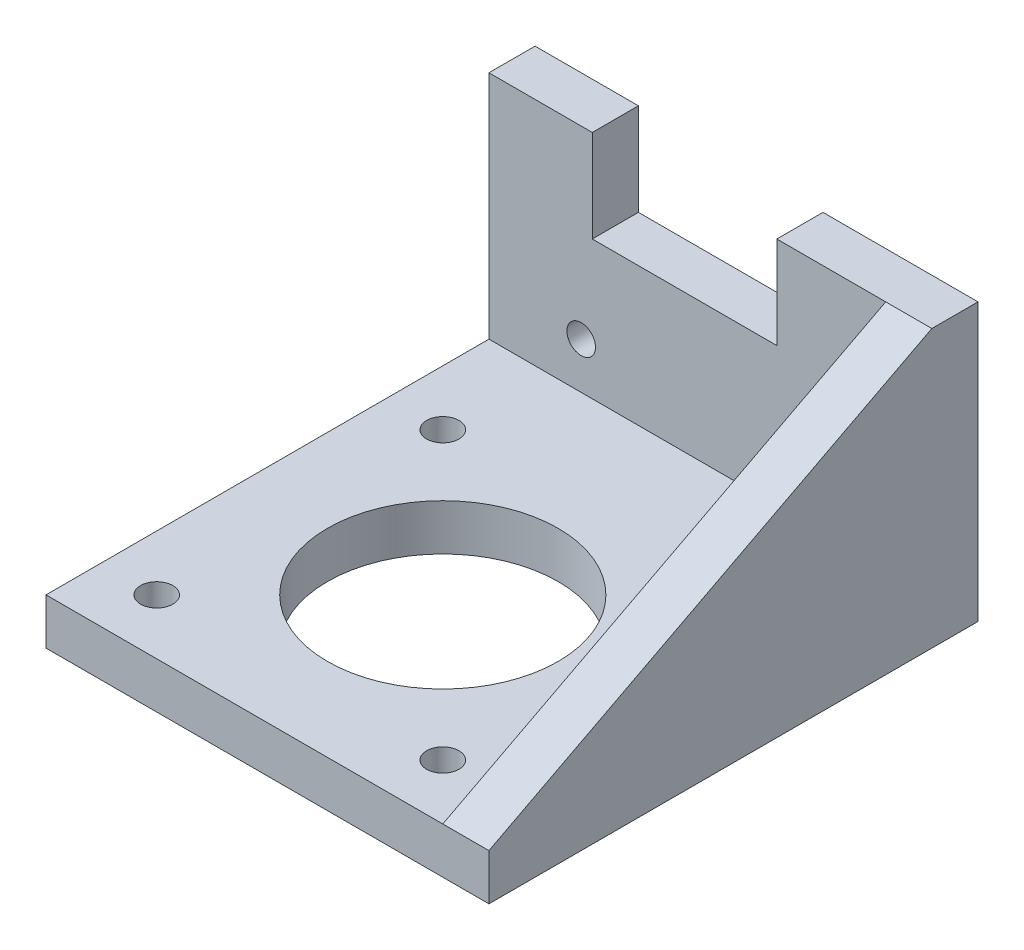
ISO-10303-21;
HEADER;
FILE_DESCRIPTION(('STEP AP214'),'2;1');
FILE_NAME('part.step','',(''),(''),'','','');
FILE_SCHEMA(('AUTOMOTIVE_DESIGN { 1 0 10303 214 1 1 1 1 }'));
ENDSEC;
DATA;
#1=APPLICATION_CONTEXT('core data for automotive mechanical design processes');
#2=APPLICATION_PROTOCOL_DEFINITION('international standard','automotive_design',2000,#1);
#3=PRODUCT_CONTEXT('',#1,'mechanical');
#4=PRODUCT('Part','Part','',(#3));
#5=PRODUCT_RELATED_PRODUCT_CATEGORY('part','',(#4));
#6=PRODUCT_DEFINITION_FORMATION('','',#4);
#7=PRODUCT_DEFINITION_CONTEXT('part definition',#1,'design');
#8=PRODUCT_DEFINITION('design','',#6,#7);
#9=PRODUCT_DEFINITION_SHAPE('','',#8);
#10=(LENGTH_UNIT() NAMED_UNIT(*) SI_UNIT(.MILLI.,.METRE.));
#11=(NAMED_UNIT(*) PLANE_ANGLE_UNIT() SI_UNIT($,.RADIAN.));
#12=(NAMED_UNIT(*) SI_UNIT($,.STERADIAN.) SOLID_ANGLE_UNIT());
#13=UNCERTAINTY_MEASURE_WITH_UNIT(LENGTH_MEASURE(1.E-05),#10,'distance_accuracy_value','');
#14=(GEOMETRIC_REPRESENTATION_CONTEXT(3) GLOBAL_UNCERTAINTY_ASSIGNED_CONTEXT((#13)) GLOBAL_UNIT_ASSIGNED_CONTEXT((#10,
#11,#12)) REPRESENTATION_CONTEXT('',''));
#15=CARTESIAN_POINT('',(0.,0.,0.));
#16=DIRECTION('',(0.,0.,1.));
#17=DIRECTION('',(1.,0.,0.));
#18=AXIS2_PLACEMENT_3D('',#15,#16,#17);
#19=CARTESIAN_POINT('',(-35.8996913580247,30.,-43.2121913580247));
#20=DIRECTION('',(0.,-1.,0.));
#21=DIRECTION('',(0.,0.,-1.));
#22=AXIS2_PLACEMENT_3D('',#19,#20,#21);
#23=PLANE('',#22);
#24=DIRECTION('',(1.,0.,0.));
#25=VECTOR('',#24,1.);
#26=CARTESIAN_POINT('',(-35.8996913580247,30.,-38.2121913580247));
#27=LINE('',#26,#25);
#28=CARTESIAN_POINT('',(-35.8996913580247,30.,-38.2121913580247));
#29=VERTEX_POINT('',#28);
#30=CARTESIAN_POINT('',(-24.6996913580247,30.,-38.2121913580247));
#31=VERTEX_POINT('',#30);
#32=EDGE_CURVE('E200',#29,#31,#27,.T.);
#33=ORIENTED_EDGE('',*,*,#32,.T.);
#34=DIRECTION('',(0.,0.,1.));
#35=VECTOR('',#34,1.);
#36=CARTESIAN_POINT('',(-24.6996913580247,30.,-43.2121913580247));
#37=LINE('',#36,#35);
#38=CARTESIAN_POINT('',(-24.6996913580247,30.,-43.2121913580247));
#39=VERTEX_POINT('',#38);
#40=EDGE_CURVE('E138',#39,#31,#37,.T.);
#41=ORIENTED_EDGE('',*,*,#40,.F.);
#42=DIRECTION('',(1.,0.,0.));
#43=VECTOR('',#42,1.);
#44=CARTESIAN_POINT('',(-35.8996913580247,30.,-43.2121913580247));
#45=LINE('',#44,#43);
#46=CARTESIAN_POINT('',(-35.8996913580247,30.,-43.2121913580247));
#47=VERTEX_POINT('',#46);
#48=EDGE_CURVE('E192',#47,#39,#45,.T.);
#49=ORIENTED_EDGE('',*,*,#48,.F.);
#50=DIRECTION('',(0.,0.,1.));
#51=VECTOR('',#50,1.);
#52=CARTESIAN_POINT('',(-35.8996913580247,30.,-43.2121913580247));
#53=LINE('',#52,#51);
#54=EDGE_CURVE('E198',#47,#29,#53,.T.);
#55=ORIENTED_EDGE('',*,*,#54,.T.);
#56=EDGE_LOOP('',(#33,#41,#49,#55));
#57=FACE_BOUND('',#56,.T.);
#58=ADVANCED_FACE('F39',(#57),#23,.F.);
#59=CARTESIAN_POINT('',(0.,5.,0.));
#60=DIRECTION('',(0.,1.,0.));
#61=DIRECTION('',(0.,0.,1.));
#62=AXIS2_PLACEMENT_3D('',#59,#60,#61);
#63=PLANE('',#62);
#64=CARTESIAN_POINT('',(1.10030864197531,5.,3.78780864197531));
#65=DIRECTION('',(0.,1.,0.));
#66=DIRECTION('',(0.,0.,1.));
#67=AXIS2_PLACEMENT_3D('',#64,#65,#66);
#68=CIRCLE('',#67,1.75);
#69=CARTESIAN_POINT('',(1.10030864197531,5.,5.53780864197531));
#70=VERTEX_POINT('',#69);
#71=EDGE_CURVE('E216',#70,#70,#68,.T.);
#72=ORIENTED_EDGE('',*,*,#71,.F.);
#73=EDGE_LOOP('',(#72));
#74=FACE_BOUND('',#73,.T.);
#75=CARTESIAN_POINT('',(-29.8996913580247,5.,-27.2121913580247));
#76=DIRECTION('',(0.,1.,0.));
#77=DIRECTION('',(0.,0.,1.));
#78=AXIS2_PLACEMENT_3D('',#75,#76,#77);
#79=CIRCLE('',#78,1.75);
#80=CARTESIAN_POINT('',(-29.8996913580247,5.,-25.4621913580247));
#81=VERTEX_POINT('',#80);
#82=EDGE_CURVE('E228',#81,#81,#79,.T.);
#83=ORIENTED_EDGE('',*,*,#82,.F.);
#84=EDGE_LOOP('',(#83));
#85=FACE_BOUND('',#84,.T.);
#86=DIRECTION('',(0.,0.,-1.));
#87=VECTOR('',#86,1.);
#88=CARTESIAN_POINT('',(7.1003086419753,5.,-33.2121913580247));
#89=LINE('',#88,#87);
#90=CARTESIAN_POINT('',(7.1003086419753,5.,9.78780864197531));
#91=VERTEX_POINT('',#90);
#92=CARTESIAN_POINT('',(7.1003086419753,5.,-38.2121913580247));
#93=VERTEX_POINT('',#92);
#94=EDGE_CURVE('E240',#91,#93,#89,.T.);
#95=ORIENTED_EDGE('',*,*,#94,.T.);
#96=DIRECTION('',(1.,0.,0.));
#97=VECTOR('',#96,1.);
#98=CARTESIAN_POINT('',(-35.8996913580247,5.,-38.2121913580247));
#99=LINE('',#98,#97);
#100=CARTESIAN_POINT('',(-35.8996913580247,5.,-38.2121913580247));
#101=VERTEX_POINT('',#100);
#102=EDGE_CURVE('E206',#101,#93,#99,.T.);
#103=ORIENTED_EDGE('',*,*,#102,.F.);
#104=DIRECTION('',(0.,0.,1.));
#105=VECTOR('',#104,1.);
#106=CARTESIAN_POINT('',(-35.8996913580247,5.,-33.2121913580247));
#107=LINE('',#106,#105);
#108=CARTESIAN_POINT('',(-35.8996913580247,5.,9.78780864197531));
#109=VERTEX_POINT('',#108);
#110=EDGE_CURVE('E63',#101,#109,#107,.T.);
#111=ORIENTED_EDGE('',*,*,#110,.T.);
#112=DIRECTION('',(1.,0.,0.));
#113=VECTOR('',#112,1.);
#114=CARTESIAN_POINT('',(-35.8996913580247,5.,9.78780864197531));
#115=LINE('',#114,#113);
#116=EDGE_CURVE('E47',#109,#91,#115,.T.);
#117=ORIENTED_EDGE('',*,*,#116,.T.);
#118=EDGE_LOOP('',(#95,#103,#111,#117));
#119=FACE_BOUND('',#118,.T.);
#120=CARTESIAN_POINT('',(1.1003086419753,5.,-27.2121913580247));
#121=DIRECTION('',(0.,1.,0.));
#122=DIRECTION('',(0.,0.,1.));
#123=AXIS2_PLACEMENT_3D('',#120,#121,#122);
#124=CIRCLE('',#123,1.75);
#125=CARTESIAN_POINT('',(1.1003086419753,5.,-25.4621913580247));
#126=VERTEX_POINT('',#125);
#127=EDGE_CURVE('E234',#126,#126,#124,.T.);
#128=ORIENTED_EDGE('',*,*,#127,.F.);
#129=EDGE_LOOP('',(#128));
#130=FACE_BOUND('',#129,.T.);
#131=CARTESIAN_POINT('',(-29.8996913580247,5.,3.78780864197531));
#132=DIRECTION('',(0.,1.,0.));
#133=DIRECTION('',(0.,0.,1.));
#134=AXIS2_PLACEMENT_3D('',#131,#132,#133);
#135=CIRCLE('',#134,1.75);
#136=CARTESIAN_POINT('',(-29.8996913580247,5.,5.53780864197531));
#137=VERTEX_POINT('',#136);
#138=EDGE_CURVE('E222',#137,#137,#135,.T.);
#139=ORIENTED_EDGE('',*,*,#138,.F.);
#140=EDGE_LOOP('',(#139));
#141=FACE_BOUND('',#140,.T.);
#142=CARTESIAN_POINT('',(-14.3996913580247,5.,-11.7121913580247));
#143=DIRECTION('',(0.,1.,0.));
#144=DIRECTION('',(0.,0.,1.));
#145=AXIS2_PLACEMENT_3D('',#142,#143,#144);
#146=CIRCLE('',#145,12.5);
#147=CARTESIAN_POINT('',(-14.3996913580247,5.,0.787808641975312));
#148=VERTEX_POINT('',#147);
#149=EDGE_CURVE('E210',#148,#148,#146,.T.);
#150=ORIENTED_EDGE('',*,*,#149,.F.);
#151=EDGE_LOOP('',(#150));
#152=FACE_BOUND('',#151,.T.);
#153=ADVANCED_FACE('F277',(#74,#85,#119,#130,#141,#152),#63,.T.);
#154=CARTESIAN_POINT('',(0.,0.,0.));
#155=DIRECTION('',(0.,1.,0.));
#156=DIRECTION('',(0.,0.,1.));
#157=AXIS2_PLACEMENT_3D('',#154,#155,#156);
#158=PLANE('',#157);
#159=DIRECTION('',(-1.,0.,0.));
#160=VECTOR('',#159,1.);
#161=CARTESIAN_POINT('',(-35.8996913580247,0.,-43.2121913580247));
#162=LINE('',#161,#160);
#163=CARTESIAN_POINT('',(12.1003086419753,0.,-43.2121913580247));
#164=VERTEX_POINT('',#163);
#165=CARTESIAN_POINT('',(-35.8996913580247,0.,-43.2121913580247));
#166=VERTEX_POINT('',#165);
#167=EDGE_CURVE('E195',#164,#166,#162,.T.);
#168=ORIENTED_EDGE('',*,*,#167,.F.);
#169=DIRECTION('',(0.,0.,-1.));
#170=VECTOR('',#169,1.);
#171=CARTESIAN_POINT('',(12.1003086419753,0.,-43.2121913580247));
#172=LINE('',#171,#170);
#173=CARTESIAN_POINT('',(12.1003086419753,0.,9.78780864197531));
#174=VERTEX_POINT('',#173);
#175=EDGE_CURVE('E159',#174,#164,#172,.T.);
#176=ORIENTED_EDGE('',*,*,#175,.F.);
#177=DIRECTION('',(1.,0.,0.));
#178=VECTOR('',#177,1.);
#179=CARTESIAN_POINT('',(-35.8996913580247,0.,9.78780864197531));
#180=LINE('',#179,#178);
#181=CARTESIAN_POINT('',(-35.8996913580247,0.,9.78780864197531));
#182=VERTEX_POINT('',#181);
#183=EDGE_CURVE('E243',#182,#174,#180,.T.);
#184=ORIENTED_EDGE('',*,*,#183,.F.);
#185=DIRECTION('',(0.,0.,1.));
#186=VECTOR('',#185,1.);
#187=CARTESIAN_POINT('',(-35.8996913580247,0.,-33.2121913580247));
#188=LINE('',#187,#186);
#189=EDGE_CURVE('E237',#166,#182,#188,.T.);
#190=ORIENTED_EDGE('',*,*,#189,.F.);
#191=EDGE_LOOP('',(#168,#176,#184,#190));
#192=FACE_BOUND('',#191,.T.);
#193=CARTESIAN_POINT('',(1.1003086419753,0.,-27.2121913580247));
#194=DIRECTION('',(0.,1.,0.));
#195=DIRECTION('',(0.,0.,1.));
#196=AXIS2_PLACEMENT_3D('',#193,#194,#195);
#197=CIRCLE('',#196,1.75);
#198=CARTESIAN_POINT('',(1.1003086419753,0.,-25.4621913580247));
#199=VERTEX_POINT('',#198);
#200=EDGE_CURVE('E231',#199,#199,#197,.T.);
#201=ORIENTED_EDGE('',*,*,#200,.T.);
#202=EDGE_LOOP('',(#201));
#203=FACE_BOUND('',#202,.T.);
#204=CARTESIAN_POINT('',(-29.8996913580247,0.,-27.2121913580247));
#205=DIRECTION('',(0.,1.,0.));
#206=DIRECTION('',(0.,0.,1.));
#207=AXIS2_PLACEMENT_3D('',#204,#205,#206);
#208=CIRCLE('',#207,1.75);
#209=CARTESIAN_POINT('',(-29.8996913580247,0.,-25.4621913580247));
#210=VERTEX_POINT('',#209);
#211=EDGE_CURVE('E225',#210,#210,#208,.T.);
#212=ORIENTED_EDGE('',*,*,#211,.T.);
#213=EDGE_LOOP('',(#212));
#214=FACE_BOUND('',#213,.T.);
#215=CARTESIAN_POINT('',(-29.8996913580247,0.,3.78780864197531));
#216=DIRECTION('',(0.,1.,0.));
#217=DIRECTION('',(0.,0.,1.));
#218=AXIS2_PLACEMENT_3D('',#215,#216,#217);
#219=CIRCLE('',#218,1.75);
#220=CARTESIAN_POINT('',(-29.8996913580247,0.,5.53780864197531));
#221=VERTEX_POINT('',#220);
#222=EDGE_CURVE('E219',#221,#221,#219,.T.);
#223=ORIENTED_EDGE('',*,*,#222,.T.);
#224=EDGE_LOOP('',(#223));
#225=FACE_BOUND('',#224,.T.);
#226=CARTESIAN_POINT('',(1.10030864197531,0.,3.78780864197531));
#227=DIRECTION('',(0.,1.,0.));
#228=DIRECTION('',(0.,0.,1.));
#229=AXIS2_PLACEMENT_3D('',#226,#227,#228);
#230=CIRCLE('',#229,1.75);
#231=CARTESIAN_POINT('',(1.10030864197531,0.,5.53780864197531));
#232=VERTEX_POINT('',#231);
#233=EDGE_CURVE('E213',#232,#232,#230,.T.);
#234=ORIENTED_EDGE('',*,*,#233,.T.);
#235=EDGE_LOOP('',(#234));
#236=FACE_BOUND('',#235,.T.);
#237=CARTESIAN_POINT('',(-14.3996913580247,0.,-11.7121913580247));
#238=DIRECTION('',(0.,1.,0.));
#239=DIRECTION('',(0.,0.,1.));
#240=AXIS2_PLACEMENT_3D('',#237,#238,#239);
#241=CIRCLE('',#240,12.5);
#242=CARTESIAN_POINT('',(-14.3996913580247,0.,0.787808641975312));
#243=VERTEX_POINT('',#242);
#244=EDGE_CURVE('E209',#243,#243,#241,.T.);
#245=ORIENTED_EDGE('',*,*,#244,.T.);
#246=EDGE_LOOP('',(#245));
#247=FACE_BOUND('',#246,.T.);
#248=ADVANCED_FACE('F257',(#192,#203,#214,#225,#236,#247),#158,.F.);
#249=CARTESIAN_POINT('',(-35.8996913580247,5.,-33.2121913580247));
#250=DIRECTION('',(1.,0.,0.));
#251=DIRECTION('',(0.,0.,-1.));
#252=AXIS2_PLACEMENT_3D('',#249,#250,#251);
#253=PLANE('',#252);
#254=ORIENTED_EDGE('',*,*,#189,.T.);
#255=DIRECTION('',(0.,-1.,0.));
#256=VECTOR('',#255,1.);
#257=CARTESIAN_POINT('',(-35.8996913580247,5.,9.78780864197531));
#258=LINE('',#257,#256);
#259=EDGE_CURVE('E11',#109,#182,#258,.T.);
#260=ORIENTED_EDGE('',*,*,#259,.F.);
#261=ORIENTED_EDGE('',*,*,#110,.F.);
#262=DIRECTION('',(0.,1.,0.));
#263=VECTOR('',#262,1.);
#264=CARTESIAN_POINT('',(-35.8996913580247,0.,-38.2121913580247));
#265=LINE('',#264,#263);
#266=EDGE_CURVE('E178',#101,#29,#265,.T.);
#267=ORIENTED_EDGE('',*,*,#266,.T.);
#268=ORIENTED_EDGE('',*,*,#54,.F.);
#269=DIRECTION('',(0.,1.,0.));
#270=VECTOR('',#269,1.);
#271=CARTESIAN_POINT('',(-35.8996913580247,0.,-43.2121913580247));
#272=LINE('',#271,#270);
#273=EDGE_CURVE('E187',#166,#47,#272,.T.);
#274=ORIENTED_EDGE('',*,*,#273,.F.);
#275=EDGE_LOOP('',(#254,#260,#261,#267,#268,#274));
#276=FACE_BOUND('',#275,.T.);
#277=ADVANCED_FACE('F41',(#276),#253,.F.);
#278=CARTESIAN_POINT('',(-35.8996913580247,5.,9.78780864197531));
#279=DIRECTION('',(0.,0.,-1.));
#280=DIRECTION('',(-1.,0.,0.));
#281=AXIS2_PLACEMENT_3D('',#278,#279,#280);
#282=PLANE('',#281);
#283=ORIENTED_EDGE('',*,*,#183,.T.);
#284=DIRECTION('',(0.,-1.,0.));
#285=VECTOR('',#284,1.);
#286=CARTESIAN_POINT('',(12.1003086419753,0.,9.78780864197531));
#287=LINE('',#286,#285);
#288=CARTESIAN_POINT('',(12.1003086419753,5.,9.78780864197531));
#289=VERTEX_POINT('',#288);
#290=EDGE_CURVE('E156',#289,#174,#287,.T.);
#291=ORIENTED_EDGE('',*,*,#290,.F.);
#292=DIRECTION('',(-1.,0.,0.));
#293=VECTOR('',#292,1.);
#294=CARTESIAN_POINT('',(12.1003086419753,5.,9.78780864197531));
#295=LINE('',#294,#293);
#296=EDGE_CURVE('E165',#289,#91,#295,.T.);
#297=ORIENTED_EDGE('',*,*,#296,.T.);
#298=ORIENTED_EDGE('',*,*,#116,.F.);
#299=ORIENTED_EDGE('',*,*,#259,.T.);
#300=EDGE_LOOP('',(#283,#291,#297,#298,#299));
#301=FACE_BOUND('',#300,.T.);
#302=ADVANCED_FACE('F249',(#301),#282,.F.);
#303=CARTESIAN_POINT('',(1.1003086419753,5.,-27.2121913580247));
#304=DIRECTION('',(0.,-1.,0.));
#305=DIRECTION('',(0.,0.,-1.));
#306=AXIS2_PLACEMENT_3D('',#303,#304,#305);
#307=CYLINDRICAL_SURFACE('',#306,1.75);
#308=ORIENTED_EDGE('',*,*,#127,.T.);
#309=EDGE_LOOP('',(#308));
#310=FACE_BOUND('',#309,.T.);
#311=ORIENTED_EDGE('',*,*,#200,.F.);
#312=EDGE_LOOP('',(#311));
#313=FACE_BOUND('',#312,.T.);
#314=ADVANCED_FACE('F315',(#310,#313),#307,.F.);
#315=CARTESIAN_POINT('',(-29.8996913580247,5.,-27.2121913580247));
#316=DIRECTION('',(0.,-1.,0.));
#317=DIRECTION('',(0.,0.,-1.));
#318=AXIS2_PLACEMENT_3D('',#315,#316,#317);
#319=CYLINDRICAL_SURFACE('',#318,1.75);
#320=ORIENTED_EDGE('',*,*,#82,.T.);
#321=EDGE_LOOP('',(#320));
#322=FACE_BOUND('',#321,.T.);
#323=ORIENTED_EDGE('',*,*,#211,.F.);
#324=EDGE_LOOP('',(#323));
#325=FACE_BOUND('',#324,.T.);
#326=ADVANCED_FACE('F322',(#322,#325),#319,.F.);
#327=CARTESIAN_POINT('',(-29.8996913580247,5.,3.78780864197531));
#328=DIRECTION('',(0.,-1.,0.));
#329=DIRECTION('',(0.,0.,-1.));
#330=AXIS2_PLACEMENT_3D('',#327,#328,#329);
#331=CYLINDRICAL_SURFACE('',#330,1.75);
#332=ORIENTED_EDGE('',*,*,#138,.T.);
#333=EDGE_LOOP('',(#332));
#334=FACE_BOUND('',#333,.T.);
#335=ORIENTED_EDGE('',*,*,#222,.F.);
#336=EDGE_LOOP('',(#335));
#337=FACE_BOUND('',#336,.T.);
#338=ADVANCED_FACE('F476',(#334,#337),#331,.F.);
#339=CARTESIAN_POINT('',(1.10030864197531,5.,3.78780864197531));
#340=DIRECTION('',(0.,-1.,0.));
#341=DIRECTION('',(0.,0.,-1.));
#342=AXIS2_PLACEMENT_3D('',#339,#340,#341);
#343=CYLINDRICAL_SURFACE('',#342,1.75);
#344=ORIENTED_EDGE('',*,*,#71,.T.);
#345=EDGE_LOOP('',(#344));
#346=FACE_BOUND('',#345,.T.);
#347=ORIENTED_EDGE('',*,*,#233,.F.);
#348=EDGE_LOOP('',(#347));
#349=FACE_BOUND('',#348,.T.);
#350=ADVANCED_FACE('F468',(#346,#349),#343,.F.);
#351=CARTESIAN_POINT('',(-14.3996913580247,5.,-11.7121913580247));
#352=DIRECTION('',(0.,-1.,0.));
#353=DIRECTION('',(0.,0.,-1.));
#354=AXIS2_PLACEMENT_3D('',#351,#352,#353);
#355=CYLINDRICAL_SURFACE('',#354,12.5);
#356=ORIENTED_EDGE('',*,*,#149,.T.);
#357=EDGE_LOOP('',(#356));
#358=FACE_BOUND('',#357,.T.);
#359=ORIENTED_EDGE('',*,*,#244,.F.);
#360=EDGE_LOOP('',(#359));
#361=FACE_BOUND('',#360,.T.);
#362=ADVANCED_FACE('F297',(#358,#361),#355,.F.);
#363=CARTESIAN_POINT('',(0.,0.,-38.2121913580247));
#364=DIRECTION('',(0.,0.,-1.));
#365=DIRECTION('',(-1.,0.,0.));
#366=AXIS2_PLACEMENT_3D('',#363,#364,#365);
#367=PLANE('',#366);
#368=CARTESIAN_POINT('',(-0.899691358024696,9.99999999990053,-38.2121913580247));
#369=DIRECTION('',(0.,0.,1.));
#370=DIRECTION('',(1.,0.,0.));
#371=AXIS2_PLACEMENT_3D('',#368,#369,#370);
#372=CIRCLE('',#371,1.55);
#373=CARTESIAN_POINT('',(0.650308641975305,9.99999999990053,-38.2121913580247));
#374=VERTEX_POINT('',#373);
#375=EDGE_CURVE('E179',#374,#374,#372,.T.);
#376=ORIENTED_EDGE('',*,*,#375,.F.);
#377=EDGE_LOOP('',(#376));
#378=FACE_BOUND('',#377,.T.);
#379=CARTESIAN_POINT('',(-25.8996913580247,9.99999999990052,-38.2121913580247));
#380=DIRECTION('',(0.,0.,1.));
#381=DIRECTION('',(1.,0.,0.));
#382=AXIS2_PLACEMENT_3D('',#379,#380,#381);
#383=CIRCLE('',#382,1.55);
#384=CARTESIAN_POINT('',(-24.3496913580247,9.99999999990052,-38.2121913580247));
#385=VERTEX_POINT('',#384);
#386=EDGE_CURVE('E174',#385,#385,#383,.T.);
#387=ORIENTED_EDGE('',*,*,#386,.F.);
#388=EDGE_LOOP('',(#387));
#389=FACE_BOUND('',#388,.T.);
#390=DIRECTION('',(1.,0.,0.));
#391=VECTOR('',#390,1.);
#392=CARTESIAN_POINT('',(-24.6996913580247,20.,-38.2121913580247));
#393=LINE('',#392,#391);
#394=CARTESIAN_POINT('',(-24.6996913580247,20.,-38.2121913580247));
#395=VERTEX_POINT('',#394);
#396=CARTESIAN_POINT('',(-4.6996913580247,20.,-38.2121913580247));
#397=VERTEX_POINT('',#396);
#398=EDGE_CURVE('E129',#395,#397,#393,.T.);
#399=ORIENTED_EDGE('',*,*,#398,.F.);
#400=DIRECTION('',(0.,1.,0.));
#401=VECTOR('',#400,1.);
#402=CARTESIAN_POINT('',(-24.6996913580247,20.,-38.2121913580247));
#403=LINE('',#402,#401);
#404=EDGE_CURVE('E168',#395,#31,#403,.T.);
#405=ORIENTED_EDGE('',*,*,#404,.T.);
#406=ORIENTED_EDGE('',*,*,#32,.F.);
#407=ORIENTED_EDGE('',*,*,#266,.F.);
#408=ORIENTED_EDGE('',*,*,#102,.T.);
#409=DIRECTION('',(0.,-1.,0.));
#410=VECTOR('',#409,1.);
#411=CARTESIAN_POINT('',(7.1003086419753,0.,-38.2121913580247));
#412=LINE('',#411,#410);
#413=CARTESIAN_POINT('',(7.1003086419753,30.,-38.2121913580247));
#414=VERTEX_POINT('',#413);
#415=EDGE_CURVE('E191',#414,#93,#412,.T.);
#416=ORIENTED_EDGE('',*,*,#415,.F.);
#417=CARTESIAN_POINT('',(-4.6996913580247,30.,-38.2121913580247));
#418=VERTEX_POINT('',#417);
#419=EDGE_CURVE('E143',#418,#414,#27,.T.);
#420=ORIENTED_EDGE('',*,*,#419,.F.);
#421=DIRECTION('',(0.,1.,0.));
#422=VECTOR('',#421,1.);
#423=CARTESIAN_POINT('',(-4.6996913580247,20.,-38.2121913580247));
#424=LINE('',#423,#422);
#425=EDGE_CURVE('E123',#397,#418,#424,.T.);
#426=ORIENTED_EDGE('',*,*,#425,.F.);
#427=EDGE_LOOP('',(#399,#405,#406,#407,#408,#416,#420,#426));
#428=FACE_BOUND('',#427,.T.);
#429=ADVANCED_FACE('F141',(#378,#389,#428),#367,.F.);
#430=CARTESIAN_POINT('',(-4.6996913580247,30.,-43.2121913580247));
#431=VERTEX_POINT('',#430);
#432=CARTESIAN_POINT('',(12.1003086419753,30.,-43.2121913580247));
#433=VERTEX_POINT('',#432);
#434=EDGE_CURVE('E190',#431,#433,#45,.T.);
#435=ORIENTED_EDGE('',*,*,#434,.F.);
#436=DIRECTION('',(0.,0.,-1.));
#437=VECTOR('',#436,1.);
#438=CARTESIAN_POINT('',(-4.6996913580247,30.,-38.2121913580247));
#439=LINE('',#438,#437);
#440=EDGE_CURVE('E274',#418,#431,#439,.T.);
#441=ORIENTED_EDGE('',*,*,#440,.F.);
#442=ORIENTED_EDGE('',*,*,#419,.T.);
#443=DIRECTION('',(-1.,0.,0.));
#444=VECTOR('',#443,1.);
#445=CARTESIAN_POINT('',(12.1003086419753,30.,-38.2121913580247));
#446=LINE('',#445,#444);
#447=CARTESIAN_POINT('',(12.1003086419753,30.,-38.2121913580247));
#448=VERTEX_POINT('',#447);
#449=EDGE_CURVE('E171',#448,#414,#446,.T.);
#450=ORIENTED_EDGE('',*,*,#449,.F.);
#451=DIRECTION('',(0.,0.,1.));
#452=VECTOR('',#451,1.);
#453=CARTESIAN_POINT('',(12.1003086419753,30.,-38.2121913580247));
#454=LINE('',#453,#452);
#455=EDGE_CURVE('E150',#433,#448,#454,.T.);
#456=ORIENTED_EDGE('',*,*,#455,.F.);
#457=EDGE_LOOP('',(#435,#441,#442,#450,#456));
#458=FACE_BOUND('',#457,.T.);
#459=ADVANCED_FACE('F288',(#458),#23,.F.);
#460=CARTESIAN_POINT('',(0.,0.,-43.2121913580247));
#461=DIRECTION('',(0.,0.,-1.));
#462=DIRECTION('',(-1.,0.,0.));
#463=AXIS2_PLACEMENT_3D('',#460,#461,#462);
#464=PLANE('',#463);
#465=DIRECTION('',(0.,1.,0.));
#466=VECTOR('',#465,1.);
#467=CARTESIAN_POINT('',(-24.6996913580247,20.,-43.2121913580247));
#468=LINE('',#467,#466);
#469=CARTESIAN_POINT('',(-24.6996913580247,20.,-43.2121913580247));
#470=VERTEX_POINT('',#469);
#471=EDGE_CURVE('E145',#470,#39,#468,.T.);
#472=ORIENTED_EDGE('',*,*,#471,.F.);
#473=DIRECTION('',(-1.,0.,0.));
#474=VECTOR('',#473,1.);
#475=CARTESIAN_POINT('',(-4.6996913580247,20.,-43.2121913580247));
#476=LINE('',#475,#474);
#477=CARTESIAN_POINT('',(-4.6996913580247,20.,-43.2121913580247));
#478=VERTEX_POINT('',#477);
#479=EDGE_CURVE('E128',#478,#470,#476,.T.);
#480=ORIENTED_EDGE('',*,*,#479,.F.);
#481=DIRECTION('',(0.,1.,0.));
#482=VECTOR('',#481,1.);
#483=CARTESIAN_POINT('',(-4.6996913580247,20.,-43.2121913580247));
#484=LINE('',#483,#482);
#485=EDGE_CURVE('E126',#478,#431,#484,.T.);
#486=ORIENTED_EDGE('',*,*,#485,.T.);
#487=ORIENTED_EDGE('',*,*,#434,.T.);
#488=DIRECTION('',(0.,1.,0.));
#489=VECTOR('',#488,1.);
#490=CARTESIAN_POINT('',(12.1003086419753,30.,-43.2121913580247));
#491=LINE('',#490,#489);
#492=EDGE_CURVE('E162',#164,#433,#491,.T.);
#493=ORIENTED_EDGE('',*,*,#492,.F.);
#494=ORIENTED_EDGE('',*,*,#167,.T.);
#495=ORIENTED_EDGE('',*,*,#273,.T.);
#496=ORIENTED_EDGE('',*,*,#48,.T.);
#497=EDGE_LOOP('',(#472,#480,#486,#487,#493,#494,#495,#496));
#498=FACE_BOUND('',#497,.T.);
#499=CARTESIAN_POINT('',(-0.899691358024696,9.99999999990053,-43.2121913580247));
#500=DIRECTION('',(0.,0.,1.));
#501=DIRECTION('',(1.,0.,0.));
#502=AXIS2_PLACEMENT_3D('',#499,#500,#501);
#503=CIRCLE('',#502,1.55);
#504=CARTESIAN_POINT('',(0.650308641975305,9.99999999990053,-43.2121913580247));
#505=VERTEX_POINT('',#504);
#506=EDGE_CURVE('E175',#505,#505,#503,.T.);
#507=ORIENTED_EDGE('',*,*,#506,.T.);
#508=EDGE_LOOP('',(#507));
#509=FACE_BOUND('',#508,.T.);
#510=CARTESIAN_POINT('',(-25.8996913580247,9.99999999990052,-43.2121913580247));
#511=DIRECTION('',(0.,0.,1.));
#512=DIRECTION('',(1.,0.,0.));
#513=AXIS2_PLACEMENT_3D('',#510,#511,#512);
#514=CIRCLE('',#513,1.55);
#515=CARTESIAN_POINT('',(-24.3496913580247,9.99999999990052,-43.2121913580247));
#516=VERTEX_POINT('',#515);
#517=EDGE_CURVE('E182',#516,#516,#514,.T.);
#518=ORIENTED_EDGE('',*,*,#517,.T.);
#519=EDGE_LOOP('',(#518));
#520=FACE_BOUND('',#519,.T.);
#521=ADVANCED_FACE('F262',(#498,#509,#520),#464,.T.);
#522=CARTESIAN_POINT('',(-25.8996913580247,9.99999999990052,-43.2121913580247));
#523=DIRECTION('',(0.,0.,1.));
#524=DIRECTION('',(1.,0.,0.));
#525=AXIS2_PLACEMENT_3D('',#522,#523,#524);
#526=CYLINDRICAL_SURFACE('',#525,1.55);
#527=ORIENTED_EDGE('',*,*,#517,.F.);
#528=EDGE_LOOP('',(#527));
#529=FACE_BOUND('',#528,.T.);
#530=ORIENTED_EDGE('',*,*,#386,.T.);
#531=EDGE_LOOP('',(#530));
#532=FACE_BOUND('',#531,.T.);
#533=ADVANCED_FACE('F295',(#529,#532),#526,.F.);
#534=CARTESIAN_POINT('',(-0.899691358024696,9.99999999990053,-43.2121913580247));
#535=DIRECTION('',(0.,0.,1.));
#536=DIRECTION('',(1.,0.,0.));
#537=AXIS2_PLACEMENT_3D('',#534,#535,#536);
#538=CYLINDRICAL_SURFACE('',#537,1.55);
#539=ORIENTED_EDGE('',*,*,#506,.F.);
#540=EDGE_LOOP('',(#539));
#541=FACE_BOUND('',#540,.T.);
#542=ORIENTED_EDGE('',*,*,#375,.T.);
#543=EDGE_LOOP('',(#542));
#544=FACE_BOUND('',#543,.T.);
#545=ADVANCED_FACE('F352',(#541,#544),#538,.F.);
#546=CARTESIAN_POINT('',(12.1003086419753,5.,9.78780864197531));
#547=DIRECTION('',(0.,-0.88691408416698,-0.461934418836968));
#548=DIRECTION('',(0.,0.461934418836968,-0.88691408416698));
#549=AXIS2_PLACEMENT_3D('',#546,#547,#548);
#550=PLANE('',#549);
#551=DIRECTION('',(0.,-0.461934418836968,0.88691408416698));
#552=VECTOR('',#551,1.);
#553=CARTESIAN_POINT('',(7.1003086419753,5.,9.78780864197531));
#554=LINE('',#553,#552);
#555=EDGE_CURVE('E154',#414,#91,#554,.T.);
#556=ORIENTED_EDGE('',*,*,#555,.T.);
#557=ORIENTED_EDGE('',*,*,#296,.F.);
#558=DIRECTION('',(0.,-0.461934418836968,0.88691408416698));
#559=VECTOR('',#558,1.);
#560=CARTESIAN_POINT('',(12.1003086419753,5.,9.78780864197531));
#561=LINE('',#560,#559);
#562=EDGE_CURVE('E153',#448,#289,#561,.T.);
#563=ORIENTED_EDGE('',*,*,#562,.F.);
#564=ORIENTED_EDGE('',*,*,#449,.T.);
#565=EDGE_LOOP('',(#556,#557,#563,#564));
#566=FACE_BOUND('',#565,.T.);
#567=ADVANCED_FACE('F283',(#566),#550,.F.);
#568=CARTESIAN_POINT('',(12.1003086419753,0.,0.));
#569=DIRECTION('',(-1.,0.,0.));
#570=DIRECTION('',(0.,0.,1.));
#571=AXIS2_PLACEMENT_3D('',#568,#569,#570);
#572=PLANE('',#571);
#573=ORIENTED_EDGE('',*,*,#455,.T.);
#574=ORIENTED_EDGE('',*,*,#562,.T.);
#575=ORIENTED_EDGE('',*,*,#290,.T.);
#576=ORIENTED_EDGE('',*,*,#175,.T.);
#577=ORIENTED_EDGE('',*,*,#492,.T.);
#578=EDGE_LOOP('',(#573,#574,#575,#576,#577));
#579=FACE_BOUND('',#578,.T.);
#580=ADVANCED_FACE('F254',(#579),#572,.F.);
#581=CARTESIAN_POINT('',(7.1003086419753,0.,0.));
#582=DIRECTION('',(-1.,0.,0.));
#583=DIRECTION('',(0.,0.,1.));
#584=AXIS2_PLACEMENT_3D('',#581,#582,#583);
#585=PLANE('',#584);
#586=ORIENTED_EDGE('',*,*,#555,.F.);
#587=ORIENTED_EDGE('',*,*,#415,.T.);
#588=ORIENTED_EDGE('',*,*,#94,.F.);
#589=EDGE_LOOP('',(#586,#587,#588));
#590=FACE_BOUND('',#589,.T.);
#591=ADVANCED_FACE('F281',(#590),#585,.T.);
#592=CARTESIAN_POINT('',(-24.6996913580247,20.,-43.2121913580247));
#593=DIRECTION('',(-1.,0.,0.));
#594=DIRECTION('',(0.,0.,1.));
#595=AXIS2_PLACEMENT_3D('',#592,#593,#594);
#596=PLANE('',#595);
#597=ORIENTED_EDGE('',*,*,#40,.T.);
#598=ORIENTED_EDGE('',*,*,#404,.F.);
#599=DIRECTION('',(0.,0.,1.));
#600=VECTOR('',#599,1.);
#601=CARTESIAN_POINT('',(-24.6996913580247,20.,-43.2121913580247));
#602=LINE('',#601,#600);
#603=EDGE_CURVE('E135',#470,#395,#602,.T.);
#604=ORIENTED_EDGE('',*,*,#603,.F.);
#605=ORIENTED_EDGE('',*,*,#471,.T.);
#606=EDGE_LOOP('',(#597,#598,#604,#605));
#607=FACE_BOUND('',#606,.T.);
#608=ADVANCED_FACE('F276',(#607),#596,.F.);
#609=CARTESIAN_POINT('',(-4.6996913580247,20.,-38.2121913580247));
#610=DIRECTION('',(1.,0.,0.));
#611=DIRECTION('',(0.,0.,-1.));
#612=AXIS2_PLACEMENT_3D('',#609,#610,#611);
#613=PLANE('',#612);
#614=ORIENTED_EDGE('',*,*,#440,.T.);
#615=ORIENTED_EDGE('',*,*,#485,.F.);
#616=DIRECTION('',(0.,0.,-1.));
#617=VECTOR('',#616,1.);
#618=CARTESIAN_POINT('',(-4.6996913580247,20.,-38.2121913580247));
#619=LINE('',#618,#617);
#620=EDGE_CURVE('E54',#397,#478,#619,.T.);
#621=ORIENTED_EDGE('',*,*,#620,.F.);
#622=ORIENTED_EDGE('',*,*,#425,.T.);
#623=EDGE_LOOP('',(#614,#615,#621,#622));
#624=FACE_BOUND('',#623,.T.);
#625=ADVANCED_FACE('F121',(#624),#613,.F.);
#626=CARTESIAN_POINT('',(0.,20.,0.));
#627=DIRECTION('',(0.,1.,0.));
#628=DIRECTION('',(0.,0.,1.));
#629=AXIS2_PLACEMENT_3D('',#626,#627,#628);
#630=PLANE('',#629);
#631=ORIENTED_EDGE('',*,*,#398,.T.);
#632=ORIENTED_EDGE('',*,*,#620,.T.);
#633=ORIENTED_EDGE('',*,*,#479,.T.);
#634=ORIENTED_EDGE('',*,*,#603,.T.);
#635=EDGE_LOOP('',(#631,#632,#633,#634));
#636=FACE_BOUND('',#635,.T.);
#637=ADVANCED_FACE('F133',(#636),#630,.T.);
#638=CLOSED_SHELL('',(#58,#153,#248,#277,#302,#314,#326,#338,#350,#362,#429,#459,#521,#533,#545,
#567,#580,#591,#608,#625,#637));
#639=MANIFOLD_SOLID_BREP('B2',#638);
#640=ADVANCED_BREP_SHAPE_REPRESENTATION('',(#18,#639),#14);
#641=SHAPE_DEFINITION_REPRESENTATION(#9,#640);
ENDSEC;
END-ISO-10303-21;
